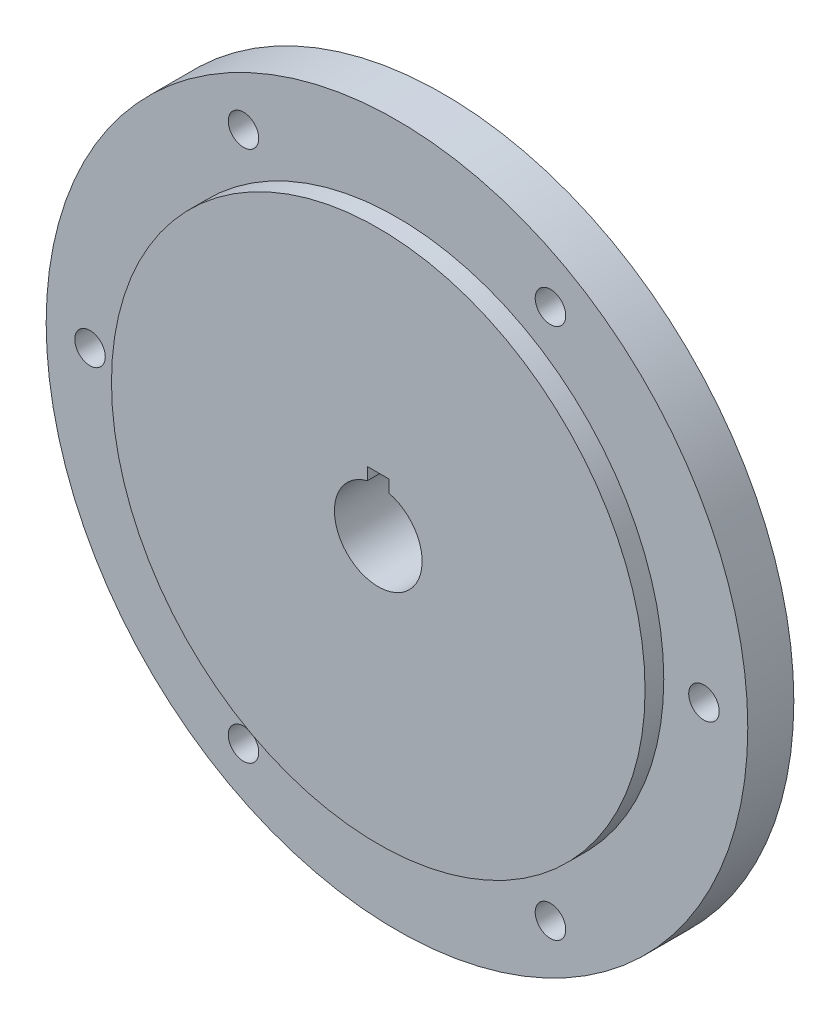
ISO-10303-21;
HEADER;
FILE_DESCRIPTION(('STEP AP214'),'2;1');
FILE_NAME('part.step','',(''),(''),'','','');
FILE_SCHEMA(('AUTOMOTIVE_DESIGN { 1 0 10303 214 1 1 1 1 }'));
ENDSEC;
DATA;
#1=APPLICATION_CONTEXT('core data for automotive mechanical design processes');
#2=APPLICATION_PROTOCOL_DEFINITION('international standard','automotive_design',2000,#1);
#3=PRODUCT_CONTEXT('',#1,'mechanical');
#4=PRODUCT('Part','Part','',(#3));
#5=PRODUCT_RELATED_PRODUCT_CATEGORY('part','',(#4));
#6=PRODUCT_DEFINITION_FORMATION('','',#4);
#7=PRODUCT_DEFINITION_CONTEXT('part definition',#1,'design');
#8=PRODUCT_DEFINITION('design','',#6,#7);
#9=PRODUCT_DEFINITION_SHAPE('','',#8);
#10=(LENGTH_UNIT() NAMED_UNIT(*) SI_UNIT(.MILLI.,.METRE.));
#11=(NAMED_UNIT(*) PLANE_ANGLE_UNIT() SI_UNIT($,.RADIAN.));
#12=(NAMED_UNIT(*) SI_UNIT($,.STERADIAN.) SOLID_ANGLE_UNIT());
#13=UNCERTAINTY_MEASURE_WITH_UNIT(LENGTH_MEASURE(1.E-05),#10,'distance_accuracy_value','');
#14=(GEOMETRIC_REPRESENTATION_CONTEXT(3) GLOBAL_UNCERTAINTY_ASSIGNED_CONTEXT((#13)) GLOBAL_UNIT_ASSIGNED_CONTEXT((#10,
#11,#12)) REPRESENTATION_CONTEXT('',''));
#15=CARTESIAN_POINT('',(0.,0.,0.));
#16=DIRECTION('',(0.,0.,1.));
#17=DIRECTION('',(1.,0.,0.));
#18=AXIS2_PLACEMENT_3D('',#15,#16,#17);
#19=CARTESIAN_POINT('',(0.,0.,10.));
#20=DIRECTION('',(0.,0.,-1.));
#21=DIRECTION('',(-1.,0.,0.));
#22=AXIS2_PLACEMENT_3D('',#19,#20,#21);
#23=CYLINDRICAL_SURFACE('',#22,76.2);
#24=CARTESIAN_POINT('',(0.,0.,10.));
#25=DIRECTION('',(0.,0.,1.));
#26=DIRECTION('',(1.,0.,0.));
#27=AXIS2_PLACEMENT_3D('',#24,#25,#26);
#28=CIRCLE('',#27,76.2);
#29=CARTESIAN_POINT('',(76.2,0.,10.));
#30=VERTEX_POINT('',#29);
#31=EDGE_CURVE('E41',#30,#30,#28,.T.);
#32=ORIENTED_EDGE('',*,*,#31,.F.);
#33=EDGE_LOOP('',(#32));
#34=FACE_BOUND('',#33,.T.);
#35=CARTESIAN_POINT('',(0.,0.,0.));
#36=DIRECTION('',(0.,0.,1.));
#37=DIRECTION('',(1.,0.,0.));
#38=AXIS2_PLACEMENT_3D('',#35,#36,#37);
#39=CIRCLE('',#38,76.2);
#40=CARTESIAN_POINT('',(76.2,0.,0.));
#41=VERTEX_POINT('',#40);
#42=EDGE_CURVE('E36',#41,#41,#39,.T.);
#43=ORIENTED_EDGE('',*,*,#42,.T.);
#44=EDGE_LOOP('',(#43));
#45=FACE_BOUND('',#44,.T.);
#46=ADVANCED_FACE('F33',(#34,#45),#23,.T.);
#47=CARTESIAN_POINT('',(0.,0.,10.));
#48=DIRECTION('',(0.,0.,1.));
#49=DIRECTION('',(1.,0.,0.));
#50=AXIS2_PLACEMENT_3D('',#47,#48,#49);
#51=PLANE('',#50);
#52=CARTESIAN_POINT('',(0.,0.,10.));
#53=DIRECTION('',(0.,0.,1.));
#54=DIRECTION('',(1.,0.,0.));
#55=AXIS2_PLACEMENT_3D('',#52,#53,#54);
#56=CIRCLE('',#55,57.9501);
#57=CARTESIAN_POINT('',(57.9501,0.,10.));
#58=VERTEX_POINT('',#57);
#59=EDGE_CURVE('E11',#58,#58,#56,.T.);
#60=ORIENTED_EDGE('',*,*,#59,.F.);
#61=EDGE_LOOP('',(#60));
#62=FACE_BOUND('',#61,.T.);
#63=CARTESIAN_POINT('',(66.675,0.,10.));
#64=DIRECTION('',(0.,0.,1.));
#65=DIRECTION('',(1.,0.,0.));
#66=AXIS2_PLACEMENT_3D('',#63,#64,#65);
#67=CIRCLE('',#66,3.31470000000001);
#68=CARTESIAN_POINT('',(69.9897,0.,10.));
#69=VERTEX_POINT('',#68);
#70=EDGE_CURVE('E114',#69,#69,#67,.T.);
#71=ORIENTED_EDGE('',*,*,#70,.F.);
#72=EDGE_LOOP('',(#71));
#73=FACE_BOUND('',#72,.T.);
#74=CARTESIAN_POINT('',(33.3375000000007,57.7422437973271,10.));
#75=DIRECTION('',(0.,0.,1.));
#76=DIRECTION('',(1.,0.,0.));
#77=AXIS2_PLACEMENT_3D('',#74,#75,#76);
#78=CIRCLE('',#77,3.31470000000002);
#79=CARTESIAN_POINT('',(36.6522000000007,57.7422437973271,10.));
#80=VERTEX_POINT('',#79);
#81=EDGE_CURVE('E121',#80,#80,#78,.T.);
#82=ORIENTED_EDGE('',*,*,#81,.F.);
#83=EDGE_LOOP('',(#82));
#84=FACE_BOUND('',#83,.T.);
#85=CARTESIAN_POINT('',(-33.3374999999995,57.7422437973278,10.));
#86=DIRECTION('',(0.,0.,1.));
#87=DIRECTION('',(1.,0.,0.));
#88=AXIS2_PLACEMENT_3D('',#85,#86,#87);
#89=CIRCLE('',#88,3.31470000000002);
#90=CARTESIAN_POINT('',(-30.0227999999995,57.7422437973278,10.));
#91=VERTEX_POINT('',#90);
#92=EDGE_CURVE('E144',#91,#91,#89,.T.);
#93=ORIENTED_EDGE('',*,*,#92,.F.);
#94=EDGE_LOOP('',(#93));
#95=FACE_BOUND('',#94,.T.);
#96=CARTESIAN_POINT('',(-66.675,4.65589036534732E-13,10.));
#97=DIRECTION('',(0.,0.,1.));
#98=DIRECTION('',(1.,0.,0.));
#99=AXIS2_PLACEMENT_3D('',#96,#97,#98);
#100=CIRCLE('',#99,3.31470000000001);
#101=CARTESIAN_POINT('',(-63.3603,4.65589036534732E-13,10.));
#102=VERTEX_POINT('',#101);
#103=EDGE_CURVE('E138',#102,#102,#100,.T.);
#104=ORIENTED_EDGE('',*,*,#103,.F.);
#105=EDGE_LOOP('',(#104));
#106=FACE_BOUND('',#105,.T.);
#107=CARTESIAN_POINT('',(-33.3375000000003,-57.7422437973273,10.));
#108=DIRECTION('',(0.,0.,1.));
#109=DIRECTION('',(1.,0.,0.));
#110=AXIS2_PLACEMENT_3D('',#107,#108,#109);
#111=CIRCLE('',#110,3.31470000000002);
#112=CARTESIAN_POINT('',(-30.0228000000002,-57.7422437973273,10.));
#113=VERTEX_POINT('',#112);
#114=EDGE_CURVE('E132',#113,#113,#111,.T.);
#115=ORIENTED_EDGE('',*,*,#114,.F.);
#116=EDGE_LOOP('',(#115));
#117=FACE_BOUND('',#116,.T.);
#118=CARTESIAN_POINT('',(33.3374999999999,-57.7422437973275,10.));
#119=DIRECTION('',(0.,0.,1.));
#120=DIRECTION('',(1.,0.,0.));
#121=AXIS2_PLACEMENT_3D('',#118,#119,#120);
#122=CIRCLE('',#121,3.31470000000002);
#123=CARTESIAN_POINT('',(36.6521999999999,-57.7422437973275,10.));
#124=VERTEX_POINT('',#123);
#125=EDGE_CURVE('E120',#124,#124,#122,.T.);
#126=ORIENTED_EDGE('',*,*,#125,.F.);
#127=EDGE_LOOP('',(#126));
#128=FACE_BOUND('',#127,.T.);
#129=ORIENTED_EDGE('',*,*,#31,.T.);
#130=EDGE_LOOP('',(#129));
#131=FACE_BOUND('',#130,.T.);
#132=ADVANCED_FACE('F157',(#62,#73,#84,#95,#106,#117,#128,#131),#51,.T.);
#133=CARTESIAN_POINT('',(0.,0.,0.));
#134=DIRECTION('',(0.,0.,1.));
#135=DIRECTION('',(1.,0.,0.));
#136=AXIS2_PLACEMENT_3D('',#133,#134,#135);
#137=PLANE('',#136);
#138=DIRECTION('',(0.,-1.,0.));
#139=VECTOR('',#138,1.);
#140=CARTESIAN_POINT('',(-2.38125,0.,0.));
#141=LINE('',#140,#139);
#142=CARTESIAN_POINT('',(-2.38125,11.90625,0.));
#143=VERTEX_POINT('',#142);
#144=CARTESIAN_POINT('',(-2.38125,9.22254159315641,0.));
#145=VERTEX_POINT('',#144);
#146=EDGE_CURVE('E87',#143,#145,#141,.T.);
#147=ORIENTED_EDGE('',*,*,#146,.T.);
#148=CARTESIAN_POINT('',(0.,0.,0.));
#149=DIRECTION('',(0.,0.,1.));
#150=DIRECTION('',(1.,0.,0.));
#151=AXIS2_PLACEMENT_3D('',#148,#149,#150);
#152=CIRCLE('',#151,9.525);
#153=CARTESIAN_POINT('',(2.38125,9.22254159315641,0.));
#154=VERTEX_POINT('',#153);
#155=EDGE_CURVE('E82',#145,#154,#152,.T.);
#156=ORIENTED_EDGE('',*,*,#155,.T.);
#157=DIRECTION('',(0.,-1.,0.));
#158=VECTOR('',#157,1.);
#159=CARTESIAN_POINT('',(2.38125,0.,0.));
#160=LINE('',#159,#158);
#161=CARTESIAN_POINT('',(2.38125,11.90625,0.));
#162=VERTEX_POINT('',#161);
#163=EDGE_CURVE('E74',#162,#154,#160,.T.);
#164=ORIENTED_EDGE('',*,*,#163,.F.);
#165=DIRECTION('',(1.,0.,0.));
#166=VECTOR('',#165,1.);
#167=CARTESIAN_POINT('',(0.,11.90625,0.));
#168=LINE('',#167,#166);
#169=EDGE_CURVE('E81',#143,#162,#168,.T.);
#170=ORIENTED_EDGE('',*,*,#169,.F.);
#171=EDGE_LOOP('',(#147,#156,#164,#170));
#172=FACE_BOUND('',#171,.T.);
#173=CARTESIAN_POINT('',(66.675,0.,0.));
#174=DIRECTION('',(0.,0.,1.));
#175=DIRECTION('',(1.,0.,0.));
#176=AXIS2_PLACEMENT_3D('',#173,#174,#175);
#177=CIRCLE('',#176,3.31470000000001);
#178=CARTESIAN_POINT('',(69.9897,0.,0.));
#179=VERTEX_POINT('',#178);
#180=EDGE_CURVE('E117',#179,#179,#177,.T.);
#181=ORIENTED_EDGE('',*,*,#180,.T.);
#182=EDGE_LOOP('',(#181));
#183=FACE_BOUND('',#182,.T.);
#184=CARTESIAN_POINT('',(33.3375000000007,57.7422437973271,0.));
#185=DIRECTION('',(0.,0.,1.));
#186=DIRECTION('',(1.,0.,0.));
#187=AXIS2_PLACEMENT_3D('',#184,#185,#186);
#188=CIRCLE('',#187,3.31470000000002);
#189=CARTESIAN_POINT('',(36.6522000000007,57.7422437973271,0.));
#190=VERTEX_POINT('',#189);
#191=EDGE_CURVE('E112',#190,#190,#188,.T.);
#192=ORIENTED_EDGE('',*,*,#191,.T.);
#193=EDGE_LOOP('',(#192));
#194=FACE_BOUND('',#193,.T.);
#195=CARTESIAN_POINT('',(-33.3374999999995,57.7422437973278,0.));
#196=DIRECTION('',(0.,0.,1.));
#197=DIRECTION('',(1.,0.,0.));
#198=AXIS2_PLACEMENT_3D('',#195,#196,#197);
#199=CIRCLE('',#198,3.31470000000002);
#200=CARTESIAN_POINT('',(-30.0227999999995,57.7422437973278,0.));
#201=VERTEX_POINT('',#200);
#202=EDGE_CURVE('E124',#201,#201,#199,.T.);
#203=ORIENTED_EDGE('',*,*,#202,.T.);
#204=EDGE_LOOP('',(#203));
#205=FACE_BOUND('',#204,.T.);
#206=CARTESIAN_POINT('',(-66.675,4.65589036534732E-13,0.));
#207=DIRECTION('',(0.,0.,1.));
#208=DIRECTION('',(1.,0.,0.));
#209=AXIS2_PLACEMENT_3D('',#206,#207,#208);
#210=CIRCLE('',#209,3.31470000000001);
#211=CARTESIAN_POINT('',(-63.3603,4.65589036534732E-13,0.));
#212=VERTEX_POINT('',#211);
#213=EDGE_CURVE('E141',#212,#212,#210,.T.);
#214=ORIENTED_EDGE('',*,*,#213,.T.);
#215=EDGE_LOOP('',(#214));
#216=FACE_BOUND('',#215,.T.);
#217=CARTESIAN_POINT('',(-33.3375000000003,-57.7422437973273,0.));
#218=DIRECTION('',(0.,0.,1.));
#219=DIRECTION('',(1.,0.,0.));
#220=AXIS2_PLACEMENT_3D('',#217,#218,#219);
#221=CIRCLE('',#220,3.31470000000002);
#222=CARTESIAN_POINT('',(-30.0228000000002,-57.7422437973273,0.));
#223=VERTEX_POINT('',#222);
#224=EDGE_CURVE('E135',#223,#223,#221,.T.);
#225=ORIENTED_EDGE('',*,*,#224,.T.);
#226=EDGE_LOOP('',(#225));
#227=FACE_BOUND('',#226,.T.);
#228=CARTESIAN_POINT('',(33.3374999999999,-57.7422437973275,0.));
#229=DIRECTION('',(0.,0.,1.));
#230=DIRECTION('',(1.,0.,0.));
#231=AXIS2_PLACEMENT_3D('',#228,#229,#230);
#232=CIRCLE('',#231,3.31470000000002);
#233=CARTESIAN_POINT('',(36.6521999999999,-57.7422437973275,0.));
#234=VERTEX_POINT('',#233);
#235=EDGE_CURVE('E129',#234,#234,#232,.T.);
#236=ORIENTED_EDGE('',*,*,#235,.T.);
#237=EDGE_LOOP('',(#236));
#238=FACE_BOUND('',#237,.T.);
#239=ORIENTED_EDGE('',*,*,#42,.F.);
#240=EDGE_LOOP('',(#239));
#241=FACE_BOUND('',#240,.T.);
#242=ADVANCED_FACE('F89',(#172,#183,#194,#205,#216,#227,#238,#241),#137,.F.);
#243=CARTESIAN_POINT('',(33.3374999999999,-57.7422437973275,10.));
#244=DIRECTION('',(0.,0.,-1.));
#245=DIRECTION('',(-1.,0.,0.));
#246=AXIS2_PLACEMENT_3D('',#243,#244,#245);
#247=CYLINDRICAL_SURFACE('',#246,3.31470000000002);
#248=ORIENTED_EDGE('',*,*,#125,.T.);
#249=EDGE_LOOP('',(#248));
#250=FACE_BOUND('',#249,.T.);
#251=ORIENTED_EDGE('',*,*,#235,.F.);
#252=EDGE_LOOP('',(#251));
#253=FACE_BOUND('',#252,.T.);
#254=ADVANCED_FACE('F156',(#250,#253),#247,.F.);
#255=CARTESIAN_POINT('',(-33.3375000000003,-57.7422437973273,10.));
#256=DIRECTION('',(0.,0.,-1.));
#257=DIRECTION('',(-1.,0.,0.));
#258=AXIS2_PLACEMENT_3D('',#255,#256,#257);
#259=CYLINDRICAL_SURFACE('',#258,3.31470000000002);
#260=ORIENTED_EDGE('',*,*,#114,.T.);
#261=EDGE_LOOP('',(#260));
#262=FACE_BOUND('',#261,.T.);
#263=ORIENTED_EDGE('',*,*,#224,.F.);
#264=EDGE_LOOP('',(#263));
#265=FACE_BOUND('',#264,.T.);
#266=ADVANCED_FACE('F162',(#262,#265),#259,.F.);
#267=CARTESIAN_POINT('',(-66.675,4.65589036534732E-13,10.));
#268=DIRECTION('',(0.,0.,-1.));
#269=DIRECTION('',(-1.,0.,0.));
#270=AXIS2_PLACEMENT_3D('',#267,#268,#269);
#271=CYLINDRICAL_SURFACE('',#270,3.31470000000001);
#272=ORIENTED_EDGE('',*,*,#103,.T.);
#273=EDGE_LOOP('',(#272));
#274=FACE_BOUND('',#273,.T.);
#275=ORIENTED_EDGE('',*,*,#213,.F.);
#276=EDGE_LOOP('',(#275));
#277=FACE_BOUND('',#276,.T.);
#278=ADVANCED_FACE('F257',(#274,#277),#271,.F.);
#279=CARTESIAN_POINT('',(-33.3374999999995,57.7422437973278,10.));
#280=DIRECTION('',(0.,0.,-1.));
#281=DIRECTION('',(-1.,0.,0.));
#282=AXIS2_PLACEMENT_3D('',#279,#280,#281);
#283=CYLINDRICAL_SURFACE('',#282,3.31470000000002);
#284=ORIENTED_EDGE('',*,*,#92,.T.);
#285=EDGE_LOOP('',(#284));
#286=FACE_BOUND('',#285,.T.);
#287=ORIENTED_EDGE('',*,*,#202,.F.);
#288=EDGE_LOOP('',(#287));
#289=FACE_BOUND('',#288,.T.);
#290=ADVANCED_FACE('F252',(#286,#289),#283,.F.);
#291=CARTESIAN_POINT('',(33.3375000000007,57.7422437973271,10.));
#292=DIRECTION('',(0.,0.,-1.));
#293=DIRECTION('',(-1.,0.,0.));
#294=AXIS2_PLACEMENT_3D('',#291,#292,#293);
#295=CYLINDRICAL_SURFACE('',#294,3.31470000000002);
#296=ORIENTED_EDGE('',*,*,#81,.T.);
#297=EDGE_LOOP('',(#296));
#298=FACE_BOUND('',#297,.T.);
#299=ORIENTED_EDGE('',*,*,#191,.F.);
#300=EDGE_LOOP('',(#299));
#301=FACE_BOUND('',#300,.T.);
#302=ADVANCED_FACE('F249',(#298,#301),#295,.F.);
#303=CARTESIAN_POINT('',(66.675,0.,10.));
#304=DIRECTION('',(0.,0.,-1.));
#305=DIRECTION('',(-1.,0.,0.));
#306=AXIS2_PLACEMENT_3D('',#303,#304,#305);
#307=CYLINDRICAL_SURFACE('',#306,3.31470000000001);
#308=ORIENTED_EDGE('',*,*,#70,.T.);
#309=EDGE_LOOP('',(#308));
#310=FACE_BOUND('',#309,.T.);
#311=ORIENTED_EDGE('',*,*,#180,.F.);
#312=EDGE_LOOP('',(#311));
#313=FACE_BOUND('',#312,.T.);
#314=ADVANCED_FACE('F183',(#310,#313),#307,.F.);
#315=CARTESIAN_POINT('',(0.,0.,14.064));
#316=DIRECTION('',(0.,0.,-1.));
#317=DIRECTION('',(-1.,0.,0.));
#318=AXIS2_PLACEMENT_3D('',#315,#316,#317);
#319=CYLINDRICAL_SURFACE('',#318,57.9501);
#320=CARTESIAN_POINT('',(0.,0.,14.064));
#321=DIRECTION('',(0.,0.,1.));
#322=DIRECTION('',(1.,0.,0.));
#323=AXIS2_PLACEMENT_3D('',#320,#321,#322);
#324=CIRCLE('',#323,57.9501);
#325=CARTESIAN_POINT('',(57.9501,0.,14.064));
#326=VERTEX_POINT('',#325);
#327=EDGE_CURVE('E107',#326,#326,#324,.T.);
#328=ORIENTED_EDGE('',*,*,#327,.F.);
#329=EDGE_LOOP('',(#328));
#330=FACE_BOUND('',#329,.T.);
#331=ORIENTED_EDGE('',*,*,#59,.T.);
#332=EDGE_LOOP('',(#331));
#333=FACE_BOUND('',#332,.T.);
#334=ADVANCED_FACE('F188',(#330,#333),#319,.T.);
#335=CARTESIAN_POINT('',(0.,0.,14.064));
#336=DIRECTION('',(0.,0.,1.));
#337=DIRECTION('',(1.,0.,0.));
#338=AXIS2_PLACEMENT_3D('',#335,#336,#337);
#339=PLANE('',#338);
#340=CARTESIAN_POINT('',(0.,0.,14.064));
#341=DIRECTION('',(0.,0.,1.));
#342=DIRECTION('',(1.,0.,0.));
#343=AXIS2_PLACEMENT_3D('',#340,#341,#342);
#344=CIRCLE('',#343,9.525);
#345=CARTESIAN_POINT('',(-2.38125,9.22254159315641,14.064));
#346=VERTEX_POINT('',#345);
#347=CARTESIAN_POINT('',(2.38125,9.22254159315641,14.064));
#348=VERTEX_POINT('',#347);
#349=EDGE_CURVE('E57',#346,#348,#344,.T.);
#350=ORIENTED_EDGE('',*,*,#349,.F.);
#351=DIRECTION('',(0.,-1.,0.));
#352=VECTOR('',#351,1.);
#353=CARTESIAN_POINT('',(-2.38125,0.,14.064));
#354=LINE('',#353,#352);
#355=CARTESIAN_POINT('',(-2.38125,11.90625,14.064));
#356=VERTEX_POINT('',#355);
#357=EDGE_CURVE('E92',#356,#346,#354,.T.);
#358=ORIENTED_EDGE('',*,*,#357,.F.);
#359=DIRECTION('',(1.,0.,0.));
#360=VECTOR('',#359,1.);
#361=CARTESIAN_POINT('',(0.,11.90625,14.064));
#362=LINE('',#361,#360);
#363=CARTESIAN_POINT('',(2.38125,11.90625,14.064));
#364=VERTEX_POINT('',#363);
#365=EDGE_CURVE('E95',#356,#364,#362,.T.);
#366=ORIENTED_EDGE('',*,*,#365,.T.);
#367=DIRECTION('',(0.,-1.,0.));
#368=VECTOR('',#367,1.);
#369=CARTESIAN_POINT('',(2.38125,0.,14.064));
#370=LINE('',#369,#368);
#371=EDGE_CURVE('E101',#364,#348,#370,.T.);
#372=ORIENTED_EDGE('',*,*,#371,.T.);
#373=EDGE_LOOP('',(#350,#358,#366,#372));
#374=FACE_BOUND('',#373,.T.);
#375=ORIENTED_EDGE('',*,*,#327,.T.);
#376=EDGE_LOOP('',(#375));
#377=FACE_BOUND('',#376,.T.);
#378=ADVANCED_FACE('F192',(#374,#377),#339,.T.);
#379=CARTESIAN_POINT('',(0.,0.,0.));
#380=DIRECTION('',(0.,0.,1.));
#381=DIRECTION('',(1.,0.,0.));
#382=AXIS2_PLACEMENT_3D('',#379,#380,#381);
#383=CYLINDRICAL_SURFACE('',#382,9.525);
#384=ORIENTED_EDGE('',*,*,#349,.T.);
#385=DIRECTION('',(0.,0.,1.));
#386=VECTOR('',#385,1.);
#387=CARTESIAN_POINT('',(2.38125,9.22254159315641,0.));
#388=LINE('',#387,#386);
#389=EDGE_CURVE('E76',#154,#348,#388,.T.);
#390=ORIENTED_EDGE('',*,*,#389,.F.);
#391=ORIENTED_EDGE('',*,*,#155,.F.);
#392=DIRECTION('',(0.,0.,1.));
#393=VECTOR('',#392,1.);
#394=CARTESIAN_POINT('',(-2.38125,9.22254159315641,0.));
#395=LINE('',#394,#393);
#396=EDGE_CURVE('E105',#145,#346,#395,.T.);
#397=ORIENTED_EDGE('',*,*,#396,.T.);
#398=EDGE_LOOP('',(#384,#390,#391,#397));
#399=FACE_BOUND('',#398,.T.);
#400=ADVANCED_FACE('F85',(#399),#383,.F.);
#401=CARTESIAN_POINT('',(-2.38125,0.,0.));
#402=DIRECTION('',(-1.,0.,0.));
#403=DIRECTION('',(0.,0.,1.));
#404=AXIS2_PLACEMENT_3D('',#401,#402,#403);
#405=PLANE('',#404);
#406=ORIENTED_EDGE('',*,*,#357,.T.);
#407=ORIENTED_EDGE('',*,*,#396,.F.);
#408=ORIENTED_EDGE('',*,*,#146,.F.);
#409=DIRECTION('',(0.,0.,1.));
#410=VECTOR('',#409,1.);
#411=CARTESIAN_POINT('',(-2.38125,11.90625,0.));
#412=LINE('',#411,#410);
#413=EDGE_CURVE('E108',#143,#356,#412,.T.);
#414=ORIENTED_EDGE('',*,*,#413,.T.);
#415=EDGE_LOOP('',(#406,#407,#408,#414));
#416=FACE_BOUND('',#415,.T.);
#417=ADVANCED_FACE('F216',(#416),#405,.F.);
#418=CARTESIAN_POINT('',(0.,11.90625,0.));
#419=DIRECTION('',(0.,-1.,0.));
#420=DIRECTION('',(0.,0.,-1.));
#421=AXIS2_PLACEMENT_3D('',#418,#419,#420);
#422=PLANE('',#421);
#423=ORIENTED_EDGE('',*,*,#365,.F.);
#424=ORIENTED_EDGE('',*,*,#413,.F.);
#425=ORIENTED_EDGE('',*,*,#169,.T.);
#426=DIRECTION('',(0.,0.,1.));
#427=VECTOR('',#426,1.);
#428=CARTESIAN_POINT('',(2.38125,11.90625,0.));
#429=LINE('',#428,#427);
#430=EDGE_CURVE('E49',#162,#364,#429,.T.);
#431=ORIENTED_EDGE('',*,*,#430,.T.);
#432=EDGE_LOOP('',(#423,#424,#425,#431));
#433=FACE_BOUND('',#432,.T.);
#434=ADVANCED_FACE('F225',(#433),#422,.T.);
#435=CARTESIAN_POINT('',(2.38125,0.,0.));
#436=DIRECTION('',(-1.,0.,0.));
#437=DIRECTION('',(0.,0.,1.));
#438=AXIS2_PLACEMENT_3D('',#435,#436,#437);
#439=PLANE('',#438);
#440=ORIENTED_EDGE('',*,*,#371,.F.);
#441=ORIENTED_EDGE('',*,*,#430,.F.);
#442=ORIENTED_EDGE('',*,*,#163,.T.);
#443=ORIENTED_EDGE('',*,*,#389,.T.);
#444=EDGE_LOOP('',(#440,#441,#442,#443));
#445=FACE_BOUND('',#444,.T.);
#446=ADVANCED_FACE('F75',(#445),#439,.T.);
#447=CLOSED_SHELL('',(#46,#132,#242,#254,#266,#278,#290,#302,#314,#334,#378,#400,#417,#434,#446));
#448=MANIFOLD_SOLID_BREP('B2',#447);
#449=ADVANCED_BREP_SHAPE_REPRESENTATION('',(#18,#448),#14);
#450=SHAPE_DEFINITION_REPRESENTATION(#9,#449);
ENDSEC;
END-ISO-10303-21;
